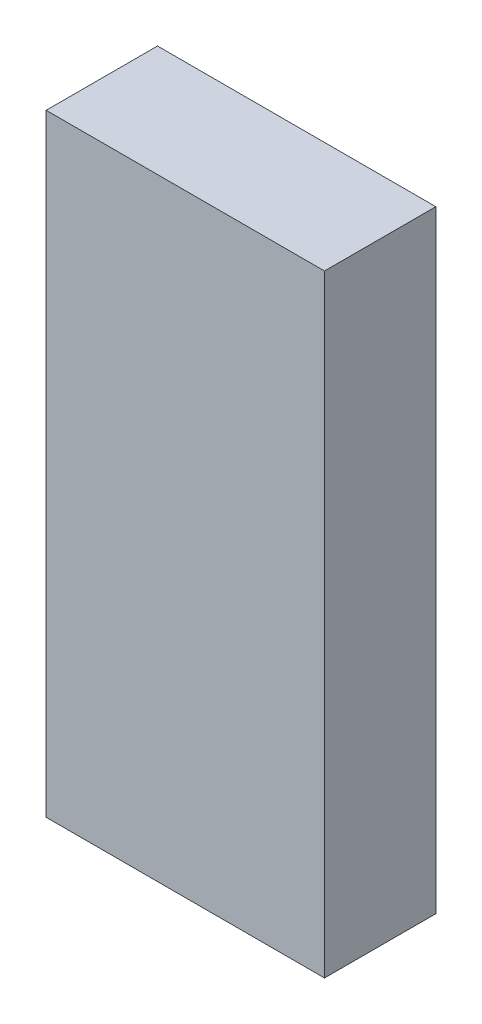
ISO-10303-21;
HEADER;
FILE_DESCRIPTION(('STEP AP214'),'2;1');
FILE_NAME('part.step','',(''),(''),'','','');
FILE_SCHEMA(('AUTOMOTIVE_DESIGN { 1 0 10303 214 1 1 1 1 }'));
ENDSEC;
DATA;
#1=APPLICATION_CONTEXT('core data for automotive mechanical design processes');
#2=APPLICATION_PROTOCOL_DEFINITION('international standard','automotive_design',2000,#1);
#3=PRODUCT_CONTEXT('',#1,'mechanical');
#4=PRODUCT('Part','Part','',(#3));
#5=PRODUCT_RELATED_PRODUCT_CATEGORY('part','',(#4));
#6=PRODUCT_DEFINITION_FORMATION('','',#4);
#7=PRODUCT_DEFINITION_CONTEXT('part definition',#1,'design');
#8=PRODUCT_DEFINITION('design','',#6,#7);
#9=PRODUCT_DEFINITION_SHAPE('','',#8);
#10=(LENGTH_UNIT() NAMED_UNIT(*) SI_UNIT(.MILLI.,.METRE.));
#11=(NAMED_UNIT(*) PLANE_ANGLE_UNIT() SI_UNIT($,.RADIAN.));
#12=(NAMED_UNIT(*) SI_UNIT($,.STERADIAN.) SOLID_ANGLE_UNIT());
#13=UNCERTAINTY_MEASURE_WITH_UNIT(LENGTH_MEASURE(1.E-05),#10,'distance_accuracy_value','');
#14=(GEOMETRIC_REPRESENTATION_CONTEXT(3) GLOBAL_UNCERTAINTY_ASSIGNED_CONTEXT((#13)) GLOBAL_UNIT_ASSIGNED_CONTEXT((#10,
#11,#12)) REPRESENTATION_CONTEXT('',''));
#15=CARTESIAN_POINT('',(0.,0.,0.));
#16=DIRECTION('',(0.,0.,1.));
#17=DIRECTION('',(1.,0.,0.));
#18=AXIS2_PLACEMENT_3D('',#15,#16,#17);
#19=CARTESIAN_POINT('',(0.,0.,14.));
#20=DIRECTION('',(-1.,0.,0.));
#21=DIRECTION('',(0.,0.,1.));
#22=AXIS2_PLACEMENT_3D('',#19,#20,#21);
#23=PLANE('',#22);
#24=DIRECTION('',(0.,1.,0.));
#25=VECTOR('',#24,1.);
#26=CARTESIAN_POINT('',(0.,0.,0.));
#27=LINE('',#26,#25);
#28=CARTESIAN_POINT('',(0.,0.,0.));
#29=VERTEX_POINT('',#28);
#30=CARTESIAN_POINT('',(0.,77.,0.));
#31=VERTEX_POINT('',#30);
#32=EDGE_CURVE('E99',#29,#31,#27,.T.);
#33=ORIENTED_EDGE('',*,*,#32,.T.);
#34=DIRECTION('',(0.,0.,-1.));
#35=VECTOR('',#34,1.);
#36=CARTESIAN_POINT('',(0.,77.,14.));
#37=LINE('',#36,#35);
#38=CARTESIAN_POINT('',(0.,77.,14.));
#39=VERTEX_POINT('',#38);
#40=EDGE_CURVE('E11',#39,#31,#37,.T.);
#41=ORIENTED_EDGE('',*,*,#40,.F.);
#42=DIRECTION('',(0.,1.,0.));
#43=VECTOR('',#42,1.);
#44=CARTESIAN_POINT('',(0.,0.,14.));
#45=LINE('',#44,#43);
#46=CARTESIAN_POINT('',(0.,0.,14.));
#47=VERTEX_POINT('',#46);
#48=EDGE_CURVE('E87',#47,#39,#45,.T.);
#49=ORIENTED_EDGE('',*,*,#48,.F.);
#50=DIRECTION('',(0.,0.,-1.));
#51=VECTOR('',#50,1.);
#52=CARTESIAN_POINT('',(0.,0.,14.));
#53=LINE('',#52,#51);
#54=EDGE_CURVE('E95',#47,#29,#53,.T.);
#55=ORIENTED_EDGE('',*,*,#54,.T.);
#56=EDGE_LOOP('',(#33,#41,#49,#55));
#57=FACE_BOUND('',#56,.T.);
#58=ADVANCED_FACE('F36',(#57),#23,.F.);
#59=CARTESIAN_POINT('',(0.,77.,14.));
#60=DIRECTION('',(0.,-1.,0.));
#61=DIRECTION('',(0.,0.,-1.));
#62=AXIS2_PLACEMENT_3D('',#59,#60,#61);
#63=PLANE('',#62);
#64=DIRECTION('',(-1.,0.,0.));
#65=VECTOR('',#64,1.);
#66=CARTESIAN_POINT('',(0.,77.,0.));
#67=LINE('',#66,#65);
#68=CARTESIAN_POINT('',(-35.,77.,0.));
#69=VERTEX_POINT('',#68);
#70=EDGE_CURVE('E91',#31,#69,#67,.T.);
#71=ORIENTED_EDGE('',*,*,#70,.T.);
#72=DIRECTION('',(0.,0.,-1.));
#73=VECTOR('',#72,1.);
#74=CARTESIAN_POINT('',(-35.,77.,14.));
#75=LINE('',#74,#73);
#76=CARTESIAN_POINT('',(-35.,77.,14.));
#77=VERTEX_POINT('',#76);
#78=EDGE_CURVE('E44',#77,#69,#75,.T.);
#79=ORIENTED_EDGE('',*,*,#78,.F.);
#80=DIRECTION('',(-1.,0.,0.));
#81=VECTOR('',#80,1.);
#82=CARTESIAN_POINT('',(0.,77.,14.));
#83=LINE('',#82,#81);
#84=EDGE_CURVE('E82',#39,#77,#83,.T.);
#85=ORIENTED_EDGE('',*,*,#84,.F.);
#86=ORIENTED_EDGE('',*,*,#40,.T.);
#87=EDGE_LOOP('',(#71,#79,#85,#86));
#88=FACE_BOUND('',#87,.T.);
#89=ADVANCED_FACE('F90',(#88),#63,.F.);
#90=CARTESIAN_POINT('',(-35.,0.,14.));
#91=DIRECTION('',(1.,0.,0.));
#92=DIRECTION('',(0.,0.,-1.));
#93=AXIS2_PLACEMENT_3D('',#90,#91,#92);
#94=PLANE('',#93);
#95=DIRECTION('',(0.,-1.,0.));
#96=VECTOR('',#95,1.);
#97=CARTESIAN_POINT('',(-35.,0.,0.));
#98=LINE('',#97,#96);
#99=CARTESIAN_POINT('',(-35.,0.,0.));
#100=VERTEX_POINT('',#99);
#101=EDGE_CURVE('E69',#69,#100,#98,.T.);
#102=ORIENTED_EDGE('',*,*,#101,.T.);
#103=DIRECTION('',(0.,0.,-1.));
#104=VECTOR('',#103,1.);
#105=CARTESIAN_POINT('',(-35.,0.,14.));
#106=LINE('',#105,#104);
#107=CARTESIAN_POINT('',(-35.,0.,14.));
#108=VERTEX_POINT('',#107);
#109=EDGE_CURVE('E92',#108,#100,#106,.T.);
#110=ORIENTED_EDGE('',*,*,#109,.F.);
#111=DIRECTION('',(0.,-1.,0.));
#112=VECTOR('',#111,1.);
#113=CARTESIAN_POINT('',(-35.,0.,14.));
#114=LINE('',#113,#112);
#115=EDGE_CURVE('E85',#77,#108,#114,.T.);
#116=ORIENTED_EDGE('',*,*,#115,.F.);
#117=ORIENTED_EDGE('',*,*,#78,.T.);
#118=EDGE_LOOP('',(#102,#110,#116,#117));
#119=FACE_BOUND('',#118,.T.);
#120=ADVANCED_FACE('F93',(#119),#94,.F.);
#121=CARTESIAN_POINT('',(0.,0.,14.));
#122=DIRECTION('',(0.,1.,0.));
#123=DIRECTION('',(-1.,0.,0.));
#124=AXIS2_PLACEMENT_3D('',#121,#122,#123);
#125=PLANE('',#124);
#126=DIRECTION('',(1.,0.,0.));
#127=VECTOR('',#126,1.);
#128=CARTESIAN_POINT('',(0.,0.,0.));
#129=LINE('',#128,#127);
#130=EDGE_CURVE('E75',#100,#29,#129,.T.);
#131=ORIENTED_EDGE('',*,*,#130,.T.);
#132=ORIENTED_EDGE('',*,*,#54,.F.);
#133=DIRECTION('',(1.,0.,0.));
#134=VECTOR('',#133,1.);
#135=CARTESIAN_POINT('',(0.,0.,14.));
#136=LINE('',#135,#134);
#137=EDGE_CURVE('E52',#108,#47,#136,.T.);
#138=ORIENTED_EDGE('',*,*,#137,.F.);
#139=ORIENTED_EDGE('',*,*,#109,.T.);
#140=EDGE_LOOP('',(#131,#132,#138,#139));
#141=FACE_BOUND('',#140,.T.);
#142=ADVANCED_FACE('F106',(#141),#125,.F.);
#143=CARTESIAN_POINT('',(0.,0.,14.));
#144=DIRECTION('',(0.,0.,1.));
#145=DIRECTION('',(1.,0.,0.));
#146=AXIS2_PLACEMENT_3D('',#143,#144,#145);
#147=PLANE('',#146);
#148=ORIENTED_EDGE('',*,*,#48,.T.);
#149=ORIENTED_EDGE('',*,*,#84,.T.);
#150=ORIENTED_EDGE('',*,*,#115,.T.);
#151=ORIENTED_EDGE('',*,*,#137,.T.);
#152=EDGE_LOOP('',(#148,#149,#150,#151));
#153=FACE_BOUND('',#152,.T.);
#154=ADVANCED_FACE('F83',(#153),#147,.T.);
#155=CARTESIAN_POINT('',(0.,0.,0.));
#156=DIRECTION('',(0.,0.,1.));
#157=DIRECTION('',(1.,0.,0.));
#158=AXIS2_PLACEMENT_3D('',#155,#156,#157);
#159=PLANE('',#158);
#160=ORIENTED_EDGE('',*,*,#32,.F.);
#161=ORIENTED_EDGE('',*,*,#130,.F.);
#162=ORIENTED_EDGE('',*,*,#101,.F.);
#163=ORIENTED_EDGE('',*,*,#70,.F.);
#164=EDGE_LOOP('',(#160,#161,#162,#163));
#165=FACE_BOUND('',#164,.T.);
#166=ADVANCED_FACE('F109',(#165),#159,.F.);
#167=CLOSED_SHELL('',(#58,#89,#120,#142,#154,#166));
#168=MANIFOLD_SOLID_BREP('B2',#167);
#169=ADVANCED_BREP_SHAPE_REPRESENTATION('',(#18,#168),#14);
#170=SHAPE_DEFINITION_REPRESENTATION(#9,#169);
ENDSEC;
END-ISO-10303-21;
